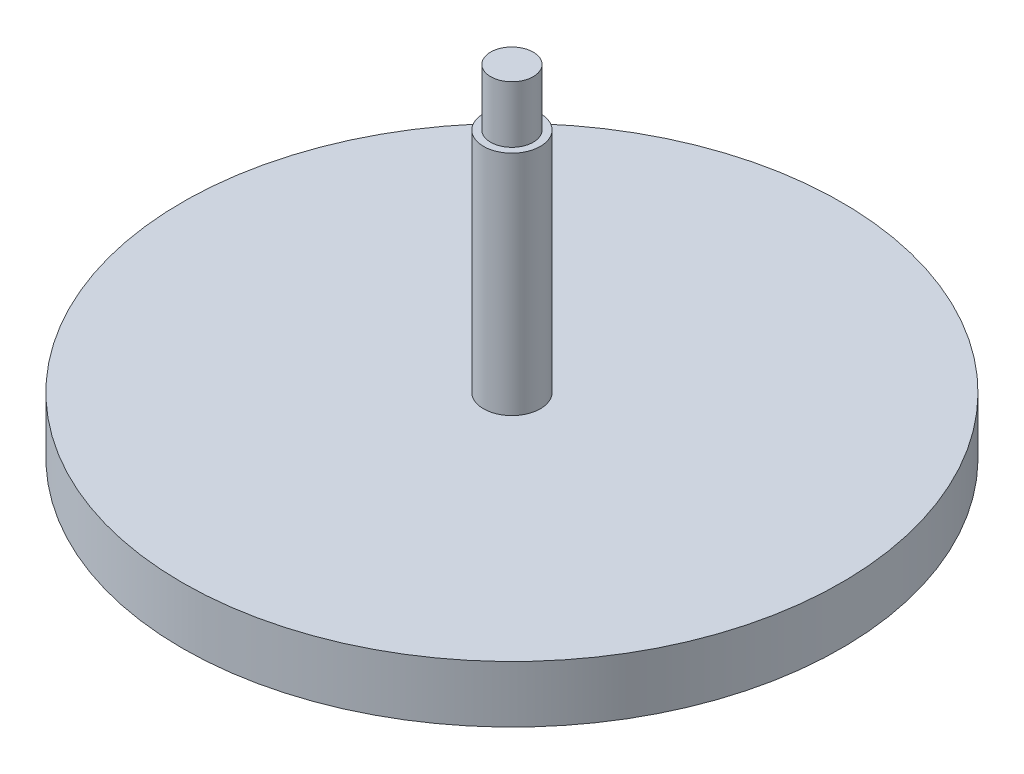
ISO-10303-21;
HEADER;
FILE_DESCRIPTION(('STEP AP214'),'2;1');
FILE_NAME('part.step','',(''),(''),'','','');
FILE_SCHEMA(('AUTOMOTIVE_DESIGN { 1 0 10303 214 1 1 1 1 }'));
ENDSEC;
DATA;
#1=APPLICATION_CONTEXT('core data for automotive mechanical design processes');
#2=APPLICATION_PROTOCOL_DEFINITION('international standard','automotive_design',2000,#1);
#3=PRODUCT_CONTEXT('',#1,'mechanical');
#4=PRODUCT('Part','Part','',(#3));
#5=PRODUCT_RELATED_PRODUCT_CATEGORY('part','',(#4));
#6=PRODUCT_DEFINITION_FORMATION('','',#4);
#7=PRODUCT_DEFINITION_CONTEXT('part definition',#1,'design');
#8=PRODUCT_DEFINITION('design','',#6,#7);
#9=PRODUCT_DEFINITION_SHAPE('','',#8);
#10=(LENGTH_UNIT() NAMED_UNIT(*) SI_UNIT(.MILLI.,.METRE.));
#11=(NAMED_UNIT(*) PLANE_ANGLE_UNIT() SI_UNIT($,.RADIAN.));
#12=(NAMED_UNIT(*) SI_UNIT($,.STERADIAN.) SOLID_ANGLE_UNIT());
#13=UNCERTAINTY_MEASURE_WITH_UNIT(LENGTH_MEASURE(1.E-05),#10,'distance_accuracy_value','');
#14=(GEOMETRIC_REPRESENTATION_CONTEXT(3) GLOBAL_UNCERTAINTY_ASSIGNED_CONTEXT((#13)) GLOBAL_UNIT_ASSIGNED_CONTEXT((#10,
#11,#12)) REPRESENTATION_CONTEXT('',''));
#15=CARTESIAN_POINT('',(0.,0.,0.));
#16=DIRECTION('',(0.,0.,1.));
#17=DIRECTION('',(1.,0.,0.));
#18=AXIS2_PLACEMENT_3D('',#15,#16,#17);
#19=CARTESIAN_POINT('',(0.,120.,0.));
#20=DIRECTION('',(0.,-1.,0.));
#21=DIRECTION('',(0.,0.,-1.));
#22=AXIS2_PLACEMENT_3D('',#19,#20,#21);
#23=CYLINDRICAL_SURFACE('',#22,10.);
#24=CARTESIAN_POINT('',(0.,20.,0.));
#25=DIRECTION('',(0.,1.,0.));
#26=DIRECTION('',(0.,0.,1.));
#27=AXIS2_PLACEMENT_3D('',#24,#25,#26);
#28=CIRCLE('',#27,10.);
#29=CARTESIAN_POINT('',(0.,20.,10.));
#30=VERTEX_POINT('',#29);
#31=EDGE_CURVE('E53',#30,#30,#28,.T.);
#32=ORIENTED_EDGE('',*,*,#31,.T.);
#33=EDGE_LOOP('',(#32));
#34=FACE_BOUND('',#33,.T.);
#35=CARTESIAN_POINT('',(0.,100.,0.));
#36=DIRECTION('',(0.,1.,0.));
#37=DIRECTION('',(0.,0.,1.));
#38=AXIS2_PLACEMENT_3D('',#35,#36,#37);
#39=CIRCLE('',#38,10.);
#40=CARTESIAN_POINT('',(0.,100.,10.));
#41=VERTEX_POINT('',#40);
#42=EDGE_CURVE('E42',#41,#41,#39,.T.);
#43=ORIENTED_EDGE('',*,*,#42,.F.);
#44=EDGE_LOOP('',(#43));
#45=FACE_BOUND('',#44,.T.);
#46=ADVANCED_FACE('F38',(#34,#45),#23,.T.);
#47=CARTESIAN_POINT('',(0.,20.,0.));
#48=DIRECTION('',(0.,-1.,0.));
#49=DIRECTION('',(0.,0.,-1.));
#50=AXIS2_PLACEMENT_3D('',#47,#48,#49);
#51=CYLINDRICAL_SURFACE('',#50,116.);
#52=CARTESIAN_POINT('',(0.,20.,0.));
#53=DIRECTION('',(0.,1.,0.));
#54=DIRECTION('',(0.,0.,1.));
#55=AXIS2_PLACEMENT_3D('',#52,#53,#54);
#56=CIRCLE('',#55,116.);
#57=CARTESIAN_POINT('',(0.,20.,116.));
#58=VERTEX_POINT('',#57);
#59=EDGE_CURVE('E11',#58,#58,#56,.T.);
#60=ORIENTED_EDGE('',*,*,#59,.F.);
#61=EDGE_LOOP('',(#60));
#62=FACE_BOUND('',#61,.T.);
#63=CARTESIAN_POINT('',(0.,0.,0.));
#64=DIRECTION('',(0.,1.,0.));
#65=DIRECTION('',(0.,0.,1.));
#66=AXIS2_PLACEMENT_3D('',#63,#64,#65);
#67=CIRCLE('',#66,116.);
#68=CARTESIAN_POINT('',(0.,0.,116.));
#69=VERTEX_POINT('',#68);
#70=EDGE_CURVE('E47',#69,#69,#67,.T.);
#71=ORIENTED_EDGE('',*,*,#70,.T.);
#72=EDGE_LOOP('',(#71));
#73=FACE_BOUND('',#72,.T.);
#74=ADVANCED_FACE('F40',(#62,#73),#51,.T.);
#75=CARTESIAN_POINT('',(0.,20.,0.));
#76=DIRECTION('',(0.,1.,0.));
#77=DIRECTION('',(0.,0.,1.));
#78=AXIS2_PLACEMENT_3D('',#75,#76,#77);
#79=PLANE('',#78);
#80=ORIENTED_EDGE('',*,*,#31,.F.);
#81=EDGE_LOOP('',(#80));
#82=FACE_BOUND('',#81,.T.);
#83=ORIENTED_EDGE('',*,*,#59,.T.);
#84=EDGE_LOOP('',(#83));
#85=FACE_BOUND('',#84,.T.);
#86=ADVANCED_FACE('F79',(#82,#85),#79,.T.);
#87=CARTESIAN_POINT('',(0.,0.,0.));
#88=DIRECTION('',(0.,1.,0.));
#89=DIRECTION('',(0.,0.,1.));
#90=AXIS2_PLACEMENT_3D('',#87,#88,#89);
#91=PLANE('',#90);
#92=ORIENTED_EDGE('',*,*,#70,.F.);
#93=EDGE_LOOP('',(#92));
#94=FACE_BOUND('',#93,.T.);
#95=ADVANCED_FACE('F86',(#94),#91,.F.);
#96=CARTESIAN_POINT('',(0.,100.,0.));
#97=DIRECTION('',(0.,1.,0.));
#98=DIRECTION('',(0.,0.,1.));
#99=AXIS2_PLACEMENT_3D('',#96,#97,#98);
#100=PLANE('',#99);
#101=CARTESIAN_POINT('',(0.,100.,0.));
#102=DIRECTION('',(0.,1.,0.));
#103=DIRECTION('',(0.,0.,1.));
#104=AXIS2_PLACEMENT_3D('',#101,#102,#103);
#105=CIRCLE('',#104,7.5);
#106=CARTESIAN_POINT('',(0.,100.,7.5));
#107=VERTEX_POINT('',#106);
#108=EDGE_CURVE('E62',#107,#107,#105,.T.);
#109=ORIENTED_EDGE('',*,*,#108,.F.);
#110=EDGE_LOOP('',(#109));
#111=FACE_BOUND('',#110,.T.);
#112=ORIENTED_EDGE('',*,*,#42,.T.);
#113=EDGE_LOOP('',(#112));
#114=FACE_BOUND('',#113,.T.);
#115=ADVANCED_FACE('F71',(#111,#114),#100,.T.);
#116=CARTESIAN_POINT('',(0.,100.,0.));
#117=DIRECTION('',(0.,1.,0.));
#118=DIRECTION('',(0.,0.,1.));
#119=AXIS2_PLACEMENT_3D('',#116,#117,#118);
#120=CYLINDRICAL_SURFACE('',#119,7.5);
#121=ORIENTED_EDGE('',*,*,#108,.T.);
#122=EDGE_LOOP('',(#121));
#123=FACE_BOUND('',#122,.T.);
#124=CARTESIAN_POINT('',(0.,120.,0.));
#125=DIRECTION('',(0.,1.,0.));
#126=DIRECTION('',(0.,0.,1.));
#127=AXIS2_PLACEMENT_3D('',#124,#125,#126);
#128=CIRCLE('',#127,7.5);
#129=CARTESIAN_POINT('',(0.,120.,7.5));
#130=VERTEX_POINT('',#129);
#131=EDGE_CURVE('E58',#130,#130,#128,.T.);
#132=ORIENTED_EDGE('',*,*,#131,.F.);
#133=EDGE_LOOP('',(#132));
#134=FACE_BOUND('',#133,.T.);
#135=ADVANCED_FACE('F93',(#123,#134),#120,.T.);
#136=CARTESIAN_POINT('',(0.,120.,0.));
#137=DIRECTION('',(0.,1.,0.));
#138=DIRECTION('',(0.,0.,1.));
#139=AXIS2_PLACEMENT_3D('',#136,#137,#138);
#140=PLANE('',#139);
#141=ORIENTED_EDGE('',*,*,#131,.T.);
#142=EDGE_LOOP('',(#141));
#143=FACE_BOUND('',#142,.T.);
#144=ADVANCED_FACE('F83',(#143),#140,.T.);
#145=CLOSED_SHELL('',(#46,#74,#86,#95,#115,#135,#144));
#146=MANIFOLD_SOLID_BREP('B2',#145);
#147=ADVANCED_BREP_SHAPE_REPRESENTATION('',(#18,#146),#14);
#148=SHAPE_DEFINITION_REPRESENTATION(#9,#147);
ENDSEC;
END-ISO-10303-21;
